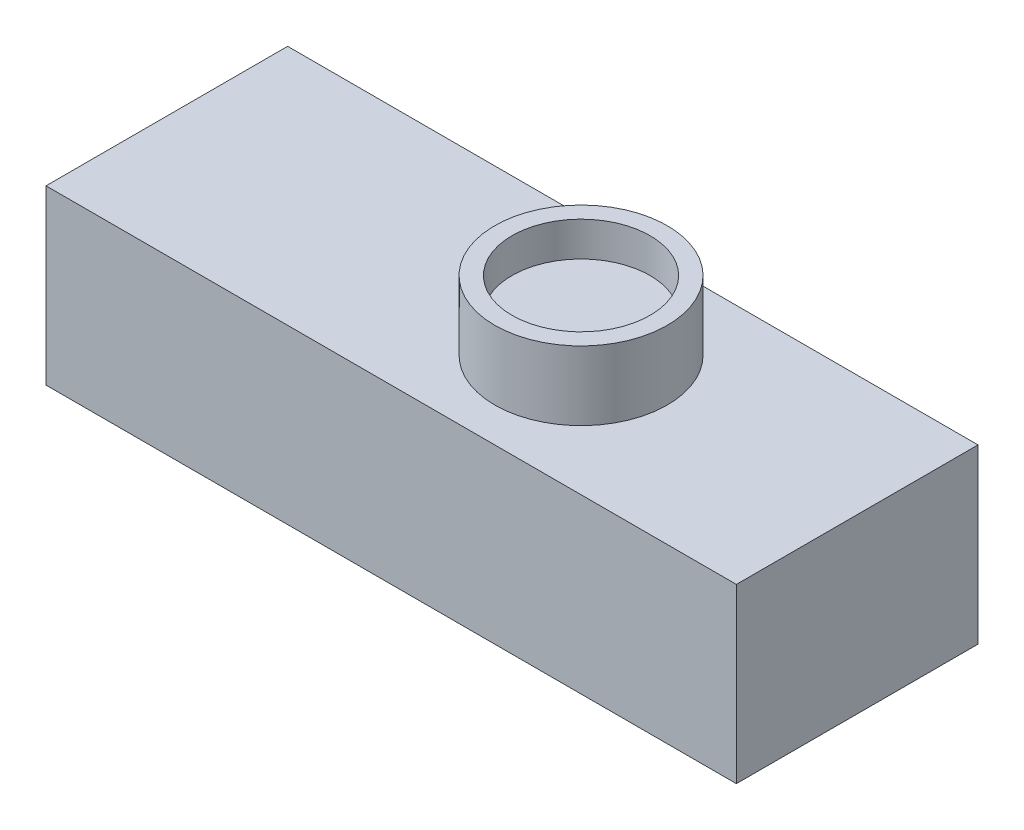
ISO-10303-21;
HEADER;
FILE_DESCRIPTION(('STEP AP214'),'2;1');
FILE_NAME('part.step','',(''),(''),'','','');
FILE_SCHEMA(('AUTOMOTIVE_DESIGN { 1 0 10303 214 1 1 1 1 }'));
ENDSEC;
DATA;
#1=APPLICATION_CONTEXT('core data for automotive mechanical design processes');
#2=APPLICATION_PROTOCOL_DEFINITION('international standard','automotive_design',2000,#1);
#3=PRODUCT_CONTEXT('',#1,'mechanical');
#4=PRODUCT('Part','Part','',(#3));
#5=PRODUCT_RELATED_PRODUCT_CATEGORY('part','',(#4));
#6=PRODUCT_DEFINITION_FORMATION('','',#4);
#7=PRODUCT_DEFINITION_CONTEXT('part definition',#1,'design');
#8=PRODUCT_DEFINITION('design','',#6,#7);
#9=PRODUCT_DEFINITION_SHAPE('','',#8);
#10=(LENGTH_UNIT() NAMED_UNIT(*) SI_UNIT(.MILLI.,.METRE.));
#11=(NAMED_UNIT(*) PLANE_ANGLE_UNIT() SI_UNIT($,.RADIAN.));
#12=(NAMED_UNIT(*) SI_UNIT($,.STERADIAN.) SOLID_ANGLE_UNIT());
#13=UNCERTAINTY_MEASURE_WITH_UNIT(LENGTH_MEASURE(1.E-05),#10,'distance_accuracy_value','');
#14=(GEOMETRIC_REPRESENTATION_CONTEXT(3) GLOBAL_UNCERTAINTY_ASSIGNED_CONTEXT((#13)) GLOBAL_UNIT_ASSIGNED_CONTEXT((#10,
#11,#12)) REPRESENTATION_CONTEXT('',''));
#15=CARTESIAN_POINT('',(0.,0.,0.));
#16=DIRECTION('',(0.,0.,1.));
#17=DIRECTION('',(1.,0.,0.));
#18=AXIS2_PLACEMENT_3D('',#15,#16,#17);
#19=CARTESIAN_POINT('',(-10.,5.,3.5));
#20=DIRECTION('',(1.,0.,0.));
#21=DIRECTION('',(0.,0.,-1.));
#22=AXIS2_PLACEMENT_3D('',#19,#20,#21);
#23=PLANE('',#22);
#24=DIRECTION('',(0.,0.,1.));
#25=VECTOR('',#24,1.);
#26=CARTESIAN_POINT('',(-10.,0.,3.5));
#27=LINE('',#26,#25);
#28=CARTESIAN_POINT('',(-10.,0.,-3.5));
#29=VERTEX_POINT('',#28);
#30=CARTESIAN_POINT('',(-10.,0.,3.5));
#31=VERTEX_POINT('',#30);
#32=EDGE_CURVE('E105',#29,#31,#27,.T.);
#33=ORIENTED_EDGE('',*,*,#32,.T.);
#34=DIRECTION('',(0.,-1.,0.));
#35=VECTOR('',#34,1.);
#36=CARTESIAN_POINT('',(-10.,5.,3.5));
#37=LINE('',#36,#35);
#38=CARTESIAN_POINT('',(-10.,5.,3.5));
#39=VERTEX_POINT('',#38);
#40=EDGE_CURVE('E42',#39,#31,#37,.T.);
#41=ORIENTED_EDGE('',*,*,#40,.F.);
#42=DIRECTION('',(0.,0.,1.));
#43=VECTOR('',#42,1.);
#44=CARTESIAN_POINT('',(-10.,5.,3.5));
#45=LINE('',#44,#43);
#46=CARTESIAN_POINT('',(-10.,5.,-3.5));
#47=VERTEX_POINT('',#46);
#48=EDGE_CURVE('E92',#47,#39,#45,.T.);
#49=ORIENTED_EDGE('',*,*,#48,.F.);
#50=DIRECTION('',(0.,-1.,0.));
#51=VECTOR('',#50,1.);
#52=CARTESIAN_POINT('',(-10.,5.,-3.5));
#53=LINE('',#52,#51);
#54=EDGE_CURVE('E101',#47,#29,#53,.T.);
#55=ORIENTED_EDGE('',*,*,#54,.T.);
#56=EDGE_LOOP('',(#33,#41,#49,#55));
#57=FACE_BOUND('',#56,.T.);
#58=ADVANCED_FACE('F39',(#57),#23,.F.);
#59=CARTESIAN_POINT('',(9.99999999999999,5.,3.5));
#60=DIRECTION('',(0.,0.,-1.));
#61=DIRECTION('',(-1.,0.,0.));
#62=AXIS2_PLACEMENT_3D('',#59,#60,#61);
#63=PLANE('',#62);
#64=DIRECTION('',(1.,0.,0.));
#65=VECTOR('',#64,1.);
#66=CARTESIAN_POINT('',(9.99999999999999,0.,3.5));
#67=LINE('',#66,#65);
#68=CARTESIAN_POINT('',(9.99999999999999,0.,3.5));
#69=VERTEX_POINT('',#68);
#70=EDGE_CURVE('E97',#31,#69,#67,.T.);
#71=ORIENTED_EDGE('',*,*,#70,.T.);
#72=DIRECTION('',(0.,-1.,0.));
#73=VECTOR('',#72,1.);
#74=CARTESIAN_POINT('',(9.99999999999999,5.,3.5));
#75=LINE('',#74,#73);
#76=CARTESIAN_POINT('',(9.99999999999999,5.,3.5));
#77=VERTEX_POINT('',#76);
#78=EDGE_CURVE('E95',#77,#69,#75,.T.);
#79=ORIENTED_EDGE('',*,*,#78,.F.);
#80=DIRECTION('',(1.,0.,0.));
#81=VECTOR('',#80,1.);
#82=CARTESIAN_POINT('',(9.99999999999999,5.,3.5));
#83=LINE('',#82,#81);
#84=EDGE_CURVE('E87',#39,#77,#83,.T.);
#85=ORIENTED_EDGE('',*,*,#84,.F.);
#86=ORIENTED_EDGE('',*,*,#40,.T.);
#87=EDGE_LOOP('',(#71,#79,#85,#86));
#88=FACE_BOUND('',#87,.T.);
#89=ADVANCED_FACE('F96',(#88),#63,.F.);
#90=CARTESIAN_POINT('',(9.99999999999999,5.,3.5));
#91=DIRECTION('',(-1.,0.,0.));
#92=DIRECTION('',(0.,0.,1.));
#93=AXIS2_PLACEMENT_3D('',#90,#91,#92);
#94=PLANE('',#93);
#95=DIRECTION('',(0.,0.,-1.));
#96=VECTOR('',#95,1.);
#97=CARTESIAN_POINT('',(9.99999999999999,0.,3.5));
#98=LINE('',#97,#96);
#99=CARTESIAN_POINT('',(9.99999999999999,0.,-3.5));
#100=VERTEX_POINT('',#99);
#101=EDGE_CURVE('E73',#69,#100,#98,.T.);
#102=ORIENTED_EDGE('',*,*,#101,.T.);
#103=DIRECTION('',(0.,-1.,0.));
#104=VECTOR('',#103,1.);
#105=CARTESIAN_POINT('',(9.99999999999999,5.,-3.5));
#106=LINE('',#105,#104);
#107=CARTESIAN_POINT('',(9.99999999999999,5.,-3.5));
#108=VERTEX_POINT('',#107);
#109=EDGE_CURVE('E98',#108,#100,#106,.T.);
#110=ORIENTED_EDGE('',*,*,#109,.F.);
#111=DIRECTION('',(0.,0.,-1.));
#112=VECTOR('',#111,1.);
#113=CARTESIAN_POINT('',(9.99999999999999,5.,3.5));
#114=LINE('',#113,#112);
#115=EDGE_CURVE('E90',#77,#108,#114,.T.);
#116=ORIENTED_EDGE('',*,*,#115,.F.);
#117=ORIENTED_EDGE('',*,*,#78,.T.);
#118=EDGE_LOOP('',(#102,#110,#116,#117));
#119=FACE_BOUND('',#118,.T.);
#120=ADVANCED_FACE('F99',(#119),#94,.F.);
#121=CARTESIAN_POINT('',(9.99999999999999,5.,-3.5));
#122=DIRECTION('',(0.,0.,1.));
#123=DIRECTION('',(1.,0.,0.));
#124=AXIS2_PLACEMENT_3D('',#121,#122,#123);
#125=PLANE('',#124);
#126=DIRECTION('',(-1.,0.,0.));
#127=VECTOR('',#126,1.);
#128=CARTESIAN_POINT('',(9.99999999999999,0.,-3.5));
#129=LINE('',#128,#127);
#130=EDGE_CURVE('E79',#100,#29,#129,.T.);
#131=ORIENTED_EDGE('',*,*,#130,.T.);
#132=ORIENTED_EDGE('',*,*,#54,.F.);
#133=DIRECTION('',(-1.,0.,0.));
#134=VECTOR('',#133,1.);
#135=CARTESIAN_POINT('',(9.99999999999999,5.,-3.5));
#136=LINE('',#135,#134);
#137=EDGE_CURVE('E56',#108,#47,#136,.T.);
#138=ORIENTED_EDGE('',*,*,#137,.F.);
#139=ORIENTED_EDGE('',*,*,#109,.T.);
#140=EDGE_LOOP('',(#131,#132,#138,#139));
#141=FACE_BOUND('',#140,.T.);
#142=ADVANCED_FACE('F113',(#141),#125,.F.);
#143=CARTESIAN_POINT('',(0.,5.,0.));
#144=DIRECTION('',(0.,1.,0.));
#145=DIRECTION('',(0.,0.,1.));
#146=AXIS2_PLACEMENT_3D('',#143,#144,#145);
#147=PLANE('',#146);
#148=CARTESIAN_POINT('',(2.,5.,0.));
#149=DIRECTION('',(0.,1.,0.));
#150=DIRECTION('',(0.,0.,1.));
#151=AXIS2_PLACEMENT_3D('',#148,#149,#150);
#152=CIRCLE('',#151,2.5);
#153=CARTESIAN_POINT('',(2.,5.,2.5));
#154=VERTEX_POINT('',#153);
#155=EDGE_CURVE('E11',#154,#154,#152,.T.);
#156=ORIENTED_EDGE('',*,*,#155,.F.);
#157=EDGE_LOOP('',(#156));
#158=FACE_BOUND('',#157,.T.);
#159=ORIENTED_EDGE('',*,*,#48,.T.);
#160=ORIENTED_EDGE('',*,*,#84,.T.);
#161=ORIENTED_EDGE('',*,*,#115,.T.);
#162=ORIENTED_EDGE('',*,*,#137,.T.);
#163=EDGE_LOOP('',(#159,#160,#161,#162));
#164=FACE_BOUND('',#163,.T.);
#165=ADVANCED_FACE('F88',(#158,#164),#147,.T.);
#166=CARTESIAN_POINT('',(0.,0.,0.));
#167=DIRECTION('',(0.,1.,0.));
#168=DIRECTION('',(0.,0.,1.));
#169=AXIS2_PLACEMENT_3D('',#166,#167,#168);
#170=PLANE('',#169);
#171=ORIENTED_EDGE('',*,*,#32,.F.);
#172=ORIENTED_EDGE('',*,*,#130,.F.);
#173=ORIENTED_EDGE('',*,*,#101,.F.);
#174=ORIENTED_EDGE('',*,*,#70,.F.);
#175=EDGE_LOOP('',(#171,#172,#173,#174));
#176=FACE_BOUND('',#175,.T.);
#177=ADVANCED_FACE('F116',(#176),#170,.F.);
#178=CARTESIAN_POINT('',(2.,7.,0.));
#179=DIRECTION('',(0.,-1.,0.));
#180=DIRECTION('',(0.,0.,-1.));
#181=AXIS2_PLACEMENT_3D('',#178,#179,#180);
#182=CYLINDRICAL_SURFACE('',#181,2.5);
#183=CARTESIAN_POINT('',(2.,7.,0.));
#184=DIRECTION('',(0.,1.,0.));
#185=DIRECTION('',(0.,0.,1.));
#186=AXIS2_PLACEMENT_3D('',#183,#184,#185);
#187=CIRCLE('',#186,2.5);
#188=CARTESIAN_POINT('',(2.,7.,2.5));
#189=VERTEX_POINT('',#188);
#190=EDGE_CURVE('E108',#189,#189,#187,.T.);
#191=ORIENTED_EDGE('',*,*,#190,.F.);
#192=EDGE_LOOP('',(#191));
#193=FACE_BOUND('',#192,.T.);
#194=ORIENTED_EDGE('',*,*,#155,.T.);
#195=EDGE_LOOP('',(#194));
#196=FACE_BOUND('',#195,.T.);
#197=ADVANCED_FACE('F139',(#193,#196),#182,.T.);
#198=CARTESIAN_POINT('',(2.,7.,0.));
#199=DIRECTION('',(0.,1.,0.));
#200=DIRECTION('',(0.,0.,1.));
#201=AXIS2_PLACEMENT_3D('',#198,#199,#200);
#202=PLANE('',#201);
#203=CARTESIAN_POINT('',(2.,7.,0.));
#204=DIRECTION('',(0.,1.,0.));
#205=DIRECTION('',(0.,0.,1.));
#206=AXIS2_PLACEMENT_3D('',#203,#204,#205);
#207=CIRCLE('',#206,2.);
#208=CARTESIAN_POINT('',(2.,7.,2.));
#209=VERTEX_POINT('',#208);
#210=EDGE_CURVE('E122',#209,#209,#207,.T.);
#211=ORIENTED_EDGE('',*,*,#210,.F.);
#212=EDGE_LOOP('',(#211));
#213=FACE_BOUND('',#212,.T.);
#214=ORIENTED_EDGE('',*,*,#190,.T.);
#215=EDGE_LOOP('',(#214));
#216=FACE_BOUND('',#215,.T.);
#217=ADVANCED_FACE('F133',(#213,#216),#202,.T.);
#218=CARTESIAN_POINT('',(2.,6.,0.));
#219=DIRECTION('',(0.,1.,0.));
#220=DIRECTION('',(0.,0.,1.));
#221=AXIS2_PLACEMENT_3D('',#218,#219,#220);
#222=CYLINDRICAL_SURFACE('',#221,2.);
#223=CARTESIAN_POINT('',(2.,6.,0.));
#224=DIRECTION('',(0.,1.,0.));
#225=DIRECTION('',(0.,0.,1.));
#226=AXIS2_PLACEMENT_3D('',#223,#224,#225);
#227=CIRCLE('',#226,2.);
#228=CARTESIAN_POINT('',(2.,6.,2.));
#229=VERTEX_POINT('',#228);
#230=EDGE_CURVE('E121',#229,#229,#227,.T.);
#231=ORIENTED_EDGE('',*,*,#230,.F.);
#232=EDGE_LOOP('',(#231));
#233=FACE_BOUND('',#232,.T.);
#234=ORIENTED_EDGE('',*,*,#210,.T.);
#235=EDGE_LOOP('',(#234));
#236=FACE_BOUND('',#235,.T.);
#237=ADVANCED_FACE('F130',(#233,#236),#222,.F.);
#238=CARTESIAN_POINT('',(2.,6.,0.));
#239=DIRECTION('',(0.,1.,0.));
#240=DIRECTION('',(0.,0.,1.));
#241=AXIS2_PLACEMENT_3D('',#238,#239,#240);
#242=PLANE('',#241);
#243=ORIENTED_EDGE('',*,*,#230,.T.);
#244=EDGE_LOOP('',(#243));
#245=FACE_BOUND('',#244,.T.);
#246=ADVANCED_FACE('F128',(#245),#242,.T.);
#247=CLOSED_SHELL('',(#58,#89,#120,#142,#165,#177,#197,#217,#237,#246));
#248=MANIFOLD_SOLID_BREP('B2',#247);
#249=ADVANCED_BREP_SHAPE_REPRESENTATION('',(#18,#248),#14);
#250=SHAPE_DEFINITION_REPRESENTATION(#9,#249);
ENDSEC;
END-ISO-10303-21;
